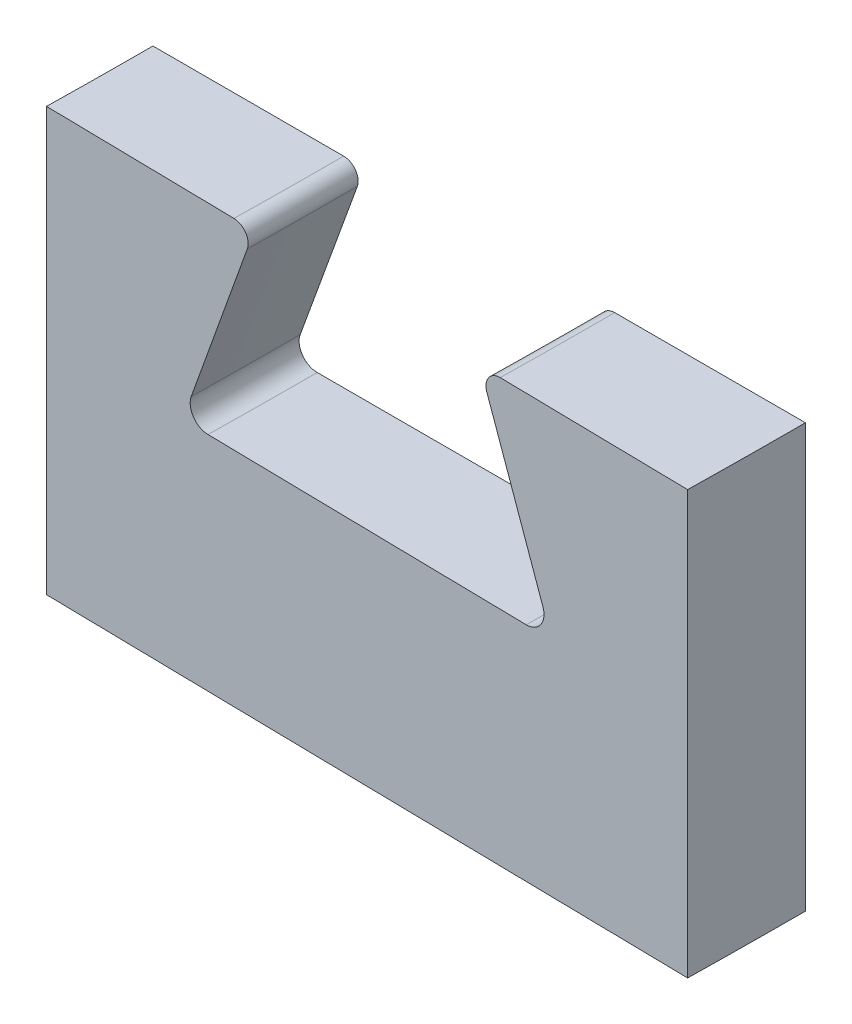
ISO-10303-21;
HEADER;
FILE_DESCRIPTION(('STEP AP214'),'2;1');
FILE_NAME('part.step','',(''),(''),'','','');
FILE_SCHEMA(('AUTOMOTIVE_DESIGN { 1 0 10303 214 1 1 1 1 }'));
ENDSEC;
DATA;
#1=APPLICATION_CONTEXT('core data for automotive mechanical design processes');
#2=APPLICATION_PROTOCOL_DEFINITION('international standard','automotive_design',2000,#1);
#3=PRODUCT_CONTEXT('',#1,'mechanical');
#4=PRODUCT('Part','Part','',(#3));
#5=PRODUCT_RELATED_PRODUCT_CATEGORY('part','',(#4));
#6=PRODUCT_DEFINITION_FORMATION('','',#4);
#7=PRODUCT_DEFINITION_CONTEXT('part definition',#1,'design');
#8=PRODUCT_DEFINITION('design','',#6,#7);
#9=PRODUCT_DEFINITION_SHAPE('','',#8);
#10=(LENGTH_UNIT() NAMED_UNIT(*) SI_UNIT(.MILLI.,.METRE.));
#11=(NAMED_UNIT(*) PLANE_ANGLE_UNIT() SI_UNIT($,.RADIAN.));
#12=(NAMED_UNIT(*) SI_UNIT($,.STERADIAN.) SOLID_ANGLE_UNIT());
#13=UNCERTAINTY_MEASURE_WITH_UNIT(LENGTH_MEASURE(1.E-05),#10,'distance_accuracy_value','');
#14=(GEOMETRIC_REPRESENTATION_CONTEXT(3) GLOBAL_UNCERTAINTY_ASSIGNED_CONTEXT((#13)) GLOBAL_UNIT_ASSIGNED_CONTEXT((#10,
#11,#12)) REPRESENTATION_CONTEXT('',''));
#15=CARTESIAN_POINT('',(0.,0.,0.));
#16=DIRECTION('',(0.,0.,1.));
#17=DIRECTION('',(1.,0.,0.));
#18=AXIS2_PLACEMENT_3D('',#15,#16,#17);
#19=CARTESIAN_POINT('',(-133.858,5.0546,0.));
#20=DIRECTION('',(0.,1.,0.));
#21=DIRECTION('',(0.,0.,1.));
#22=AXIS2_PLACEMENT_3D('',#19,#20,#21);
#23=TOROIDAL_SURFACE('',#22,130.454103897582,0.381000000000001);
#24=CARTESIAN_POINT('',(-133.858,5.18494180003675,0.));
#25=DIRECTION('',(0.,1.,0.));
#26=DIRECTION('',(0.,0.,1.));
#27=AXIS2_PLACEMENT_3D('',#24,#25,#26);
#28=CIRCLE('',#27,130.096092703395);
#29=CARTESIAN_POINT('',(-3.78172156165854,5.18494180003675,2.27048988576216));
#30=VERTEX_POINT('',#29);
#31=CARTESIAN_POINT('',(-3.76190729660525,5.18494180003675,0.));
#32=VERTEX_POINT('',#31);
#33=EDGE_CURVE('E11',#30,#32,#28,.T.);
#34=ORIENTED_EDGE('',*,*,#33,.F.);
#35=CARTESIAN_POINT('',(-3.42376489431051,5.0546,2.27673804263221));
#36=DIRECTION('',(0.0174524064372835,0.,-0.999847695156391));
#37=DIRECTION('',(0.999847695156391,0.,0.0174524064372835));
#38=AXIS2_PLACEMENT_3D('',#35,#36,#37);
#39=CIRCLE('',#38,0.381000000000001);
#40=CARTESIAN_POINT('',(-3.42376489431051,4.6736,2.27673804263221));
#41=VERTEX_POINT('',#40);
#42=EDGE_CURVE('E176',#41,#30,#39,.T.);
#43=ORIENTED_EDGE('',*,*,#42,.F.);
#44=CARTESIAN_POINT('',(-133.858,4.6736,0.));
#45=DIRECTION('',(0.,1.,0.));
#46=DIRECTION('',(0.,0.,1.));
#47=AXIS2_PLACEMENT_3D('',#44,#45,#46);
#48=CIRCLE('',#47,130.454103897582);
#49=CARTESIAN_POINT('',(-3.40389610241828,4.6736,0.));
#50=VERTEX_POINT('',#49);
#51=EDGE_CURVE('E56',#41,#50,#48,.T.);
#52=ORIENTED_EDGE('',*,*,#51,.T.);
#53=CARTESIAN_POINT('',(-3.40389610241828,5.0546,0.));
#54=DIRECTION('',(0.,0.,-1.));
#55=DIRECTION('',(1.,0.,0.));
#56=AXIS2_PLACEMENT_3D('',#53,#54,#55);
#57=CIRCLE('',#56,0.381000000000001);
#58=EDGE_CURVE('E140',#50,#32,#57,.T.);
#59=ORIENTED_EDGE('',*,*,#58,.T.);
#60=EDGE_LOOP('',(#34,#43,#52,#59));
#61=FACE_BOUND('',#60,.T.);
#62=ADVANCED_FACE('F41',(#61),#23,.F.);
#63=CARTESIAN_POINT('',(-133.858,5.18494180003675,0.));
#64=DIRECTION('',(0.,1.,0.));
#65=DIRECTION('',(0.,0.,1.));
#66=AXIS2_PLACEMENT_3D('',#63,#64,#65);
#67=CONICAL_SURFACE('',#66,130.096092703395,0.349155581964493);
#68=CARTESIAN_POINT('',(-133.858,8.4809265112345,0.));
#69=DIRECTION('',(0.,1.,0.));
#70=DIRECTION('',(0.,0.,1.));
#71=AXIS2_PLACEMENT_3D('',#68,#69,#70);
#72=CIRCLE('',#71,131.296067975472);
#73=CARTESIAN_POINT('',(-2.58192905162774,8.4809265112345,2.29143234192514));
#74=VERTEX_POINT('',#73);
#75=CARTESIAN_POINT('',(-2.56193202452829,8.4809265112345,0.));
#76=VERTEX_POINT('',#75);
#77=EDGE_CURVE('E49',#74,#76,#72,.T.);
#78=ORIENTED_EDGE('',*,*,#77,.F.);
#79=DIRECTION('',(0.342052357872111,0.939661926999925,0.00597054611550764));
#80=VECTOR('',#79,1.);
#81=CARTESIAN_POINT('',(-2.58192905162774,8.4809265112345,2.29143234192514));
#82=LINE('',#81,#80);
#83=EDGE_CURVE('E136',#30,#74,#82,.T.);
#84=ORIENTED_EDGE('',*,*,#83,.F.);
#85=ORIENTED_EDGE('',*,*,#33,.T.);
#86=DIRECTION('',(0.3421044620387,0.939661926999925,0.));
#87=VECTOR('',#86,1.);
#88=CARTESIAN_POINT('',(-2.56193202452829,8.4809265112345,0.));
#89=LINE('',#88,#87);
#90=EDGE_CURVE('E133',#32,#76,#89,.T.);
#91=ORIENTED_EDGE('',*,*,#90,.T.);
#92=EDGE_LOOP('',(#78,#84,#85,#91));
#93=FACE_BOUND('',#92,.T.);
#94=ADVANCED_FACE('F43',(#93),#67,.T.);
#95=CARTESIAN_POINT('',(-133.858,8.5851999636868,0.));
#96=DIRECTION('',(0.,1.,0.));
#97=DIRECTION('',(0.,0.,1.));
#98=AXIS2_PLACEMENT_3D('',#95,#96,#97);
#99=TOROIDAL_SURFACE('',#98,131.009658986,0.304800036313197);
#100=CARTESIAN_POINT('',(-133.858,8.89,0.));
#101=DIRECTION('',(0.,1.,0.));
#102=DIRECTION('',(0.,0.,1.));
#103=AXIS2_PLACEMENT_3D('',#100,#101,#102);
#104=CIRCLE('',#103,131.009658986);
#105=CARTESIAN_POINT('',(-2.86829441962309,8.89,2.28643381583359));
#106=VERTEX_POINT('',#105);
#107=CARTESIAN_POINT('',(-2.848341014,8.89,0.));
#108=VERTEX_POINT('',#107);
#109=EDGE_CURVE('E224',#106,#108,#104,.T.);
#110=ORIENTED_EDGE('',*,*,#109,.F.);
#111=CARTESIAN_POINT('',(-2.86829441962309,8.5851999636868,2.28643381583359));
#112=DIRECTION('',(-0.0174524064372835,0.,0.999847695156391));
#113=DIRECTION('',(-0.999847695156391,0.,-0.0174524064372835));
#114=AXIS2_PLACEMENT_3D('',#111,#112,#113);
#115=CIRCLE('',#114,0.304800036313197);
#116=EDGE_CURVE('E179',#74,#106,#115,.T.);
#117=ORIENTED_EDGE('',*,*,#116,.F.);
#118=ORIENTED_EDGE('',*,*,#77,.T.);
#119=CARTESIAN_POINT('',(-2.848341014,8.5851999636868,0.));
#120=DIRECTION('',(0.,0.,1.));
#121=DIRECTION('',(-1.,0.,0.));
#122=AXIS2_PLACEMENT_3D('',#119,#120,#121);
#123=CIRCLE('',#122,0.304800036313197);
#124=EDGE_CURVE('E147',#76,#108,#123,.T.);
#125=ORIENTED_EDGE('',*,*,#124,.T.);
#126=EDGE_LOOP('',(#110,#117,#118,#125));
#127=FACE_BOUND('',#126,.T.);
#128=ADVANCED_FACE('F227',(#127),#99,.T.);
#129=CARTESIAN_POINT('',(-6.87734271513831,8.89,2.21645561753501));
#130=DIRECTION('',(0.,-1.,0.));
#131=DIRECTION('',(0.,0.,-1.));
#132=AXIS2_PLACEMENT_3D('',#129,#130,#131);
#133=PLANE('',#132);
#134=CARTESIAN_POINT('',(-133.858,8.89,0.));
#135=DIRECTION('',(0.,1.,0.));
#136=DIRECTION('',(0.,0.,1.));
#137=AXIS2_PLACEMENT_3D('',#134,#135,#136);
#138=CIRCLE('',#137,127.);
#139=CARTESIAN_POINT('',(-6.87734271513831,8.89,2.21645561753501));
#140=VERTEX_POINT('',#139);
#141=CARTESIAN_POINT('',(-6.858,8.89,0.));
#142=VERTEX_POINT('',#141);
#143=EDGE_CURVE('E222',#140,#142,#138,.T.);
#144=ORIENTED_EDGE('',*,*,#143,.F.);
#145=DIRECTION('',(-0.999847695156391,0.,-0.0174524064372835));
#146=VECTOR('',#145,1.);
#147=CARTESIAN_POINT('',(-6.87734271513831,8.89,2.21645561753501));
#148=LINE('',#147,#146);
#149=EDGE_CURVE('E182',#106,#140,#148,.T.);
#150=ORIENTED_EDGE('',*,*,#149,.F.);
#151=ORIENTED_EDGE('',*,*,#109,.T.);
#152=DIRECTION('',(-1.,0.,0.));
#153=VECTOR('',#152,1.);
#154=CARTESIAN_POINT('',(-6.858,8.89,0.));
#155=LINE('',#154,#153);
#156=EDGE_CURVE('E149',#108,#142,#155,.T.);
#157=ORIENTED_EDGE('',*,*,#156,.T.);
#158=EDGE_LOOP('',(#144,#150,#151,#157));
#159=FACE_BOUND('',#158,.T.);
#160=ADVANCED_FACE('F259',(#159),#133,.F.);
#161=CARTESIAN_POINT('',(-133.858,15.8510320827148,0.));
#162=DIRECTION('',(0.,1.,0.));
#163=DIRECTION('',(0.,0.,1.));
#164=AXIS2_PLACEMENT_3D('',#161,#162,#163);
#165=CYLINDRICAL_SURFACE('',#164,127.);
#166=CARTESIAN_POINT('',(-133.858,0.,0.));
#167=DIRECTION('',(0.,1.,0.));
#168=DIRECTION('',(0.,0.,1.));
#169=AXIS2_PLACEMENT_3D('',#166,#167,#168);
#170=CIRCLE('',#169,127.);
#171=CARTESIAN_POINT('',(-6.8773427151383,0.,2.21645561753501));
#172=VERTEX_POINT('',#171);
#173=CARTESIAN_POINT('',(-6.858,0.,0.));
#174=VERTEX_POINT('',#173);
#175=EDGE_CURVE('E220',#172,#174,#170,.T.);
#176=ORIENTED_EDGE('',*,*,#175,.F.);
#177=DIRECTION('',(0.,-1.,0.));
#178=VECTOR('',#177,1.);
#179=CARTESIAN_POINT('',(-6.8773427151383,0.,2.21645561753501));
#180=LINE('',#179,#178);
#181=EDGE_CURVE('E185',#140,#172,#180,.T.);
#182=ORIENTED_EDGE('',*,*,#181,.F.);
#183=ORIENTED_EDGE('',*,*,#143,.T.);
#184=DIRECTION('',(0.,-1.,0.));
#185=VECTOR('',#184,1.);
#186=CARTESIAN_POINT('',(-6.858,0.,0.));
#187=LINE('',#186,#185);
#188=EDGE_CURVE('E154',#142,#174,#187,.T.);
#189=ORIENTED_EDGE('',*,*,#188,.T.);
#190=EDGE_LOOP('',(#176,#182,#183,#189));
#191=FACE_BOUND('',#190,.T.);
#192=ADVANCED_FACE('F257',(#191),#165,.F.);
#193=CARTESIAN_POINT('',(-6.8773427151383,0.,2.21645561753501));
#194=DIRECTION('',(0.,1.,0.));
#195=DIRECTION('',(0.,0.,1.));
#196=AXIS2_PLACEMENT_3D('',#193,#194,#195);
#197=PLANE('',#196);
#198=CARTESIAN_POINT('',(-133.858,0.,0.));
#199=DIRECTION('',(0.,1.,0.));
#200=DIRECTION('',(0.,0.,1.));
#201=AXIS2_PLACEMENT_3D('',#198,#199,#200);
#202=CIRCLE('',#201,140.716);
#203=CARTESIAN_POINT('',(6.83656827162675,0.,2.45583282422879));
#204=VERTEX_POINT('',#203);
#205=CARTESIAN_POINT('',(6.858,0.,0.));
#206=VERTEX_POINT('',#205);
#207=EDGE_CURVE('E218',#204,#206,#202,.T.);
#208=ORIENTED_EDGE('',*,*,#207,.F.);
#209=DIRECTION('',(0.999847695156391,0.,0.0174524064372835));
#210=VECTOR('',#209,1.);
#211=CARTESIAN_POINT('',(-6.8773427151383,0.,2.21645561753501));
#212=LINE('',#211,#210);
#213=EDGE_CURVE('E188',#172,#204,#212,.T.);
#214=ORIENTED_EDGE('',*,*,#213,.F.);
#215=ORIENTED_EDGE('',*,*,#175,.T.);
#216=DIRECTION('',(1.,0.,0.));
#217=VECTOR('',#216,1.);
#218=CARTESIAN_POINT('',(-6.858,0.,0.));
#219=LINE('',#218,#217);
#220=EDGE_CURVE('E157',#174,#206,#219,.T.);
#221=ORIENTED_EDGE('',*,*,#220,.T.);
#222=EDGE_LOOP('',(#208,#214,#215,#221));
#223=FACE_BOUND('',#222,.T.);
#224=ADVANCED_FACE('F254',(#223),#197,.F.);
#225=CARTESIAN_POINT('',(-133.858,15.8510320827148,0.));
#226=DIRECTION('',(0.,1.,0.));
#227=DIRECTION('',(0.,0.,1.));
#228=AXIS2_PLACEMENT_3D('',#225,#226,#227);
#229=CYLINDRICAL_SURFACE('',#228,140.716);
#230=CARTESIAN_POINT('',(-133.858,8.89,0.));
#231=DIRECTION('',(0.,1.,0.));
#232=DIRECTION('',(0.,0.,1.));
#233=AXIS2_PLACEMENT_3D('',#230,#231,#232);
#234=CIRCLE('',#233,140.716);
#235=CARTESIAN_POINT('',(6.83656827162675,8.89,2.45583282422879));
#236=VERTEX_POINT('',#235);
#237=CARTESIAN_POINT('',(6.858,8.89,0.));
#238=VERTEX_POINT('',#237);
#239=EDGE_CURVE('E216',#236,#238,#234,.T.);
#240=ORIENTED_EDGE('',*,*,#239,.F.);
#241=DIRECTION('',(0.,1.,0.));
#242=VECTOR('',#241,1.);
#243=CARTESIAN_POINT('',(6.83656827162675,0.,2.45583282422879));
#244=LINE('',#243,#242);
#245=EDGE_CURVE('E191',#204,#236,#244,.T.);
#246=ORIENTED_EDGE('',*,*,#245,.F.);
#247=ORIENTED_EDGE('',*,*,#207,.T.);
#248=DIRECTION('',(0.,1.,0.));
#249=VECTOR('',#248,1.);
#250=CARTESIAN_POINT('',(6.858,0.,0.));
#251=LINE('',#250,#249);
#252=EDGE_CURVE('E160',#206,#238,#251,.T.);
#253=ORIENTED_EDGE('',*,*,#252,.T.);
#254=EDGE_LOOP('',(#240,#246,#247,#253));
#255=FACE_BOUND('',#254,.T.);
#256=ADVANCED_FACE('F250',(#255),#229,.T.);
#257=CARTESIAN_POINT('',(6.83656827162675,8.89,2.45583282422879));
#258=DIRECTION('',(0.,-1.,0.));
#259=DIRECTION('',(0.,0.,-1.));
#260=AXIS2_PLACEMENT_3D('',#257,#258,#259);
#261=PLANE('',#260);
#262=CARTESIAN_POINT('',(-133.858,8.89,0.));
#263=DIRECTION('',(0.,1.,0.));
#264=DIRECTION('',(0.,0.,1.));
#265=AXIS2_PLACEMENT_3D('',#262,#263,#264);
#266=CIRCLE('',#265,136.706341014);
#267=CARTESIAN_POINT('',(2.82751997611154,8.89,2.38585462593021));
#268=VERTEX_POINT('',#267);
#269=CARTESIAN_POINT('',(2.848341014,8.89,0.));
#270=VERTEX_POINT('',#269);
#271=EDGE_CURVE('E214',#268,#270,#266,.T.);
#272=ORIENTED_EDGE('',*,*,#271,.F.);
#273=DIRECTION('',(-0.999847695156391,0.,-0.0174524064372835));
#274=VECTOR('',#273,1.);
#275=CARTESIAN_POINT('',(6.83656827162675,8.89,2.45583282422879));
#276=LINE('',#275,#274);
#277=EDGE_CURVE('E194',#236,#268,#276,.T.);
#278=ORIENTED_EDGE('',*,*,#277,.F.);
#279=ORIENTED_EDGE('',*,*,#239,.T.);
#280=DIRECTION('',(-1.,0.,0.));
#281=VECTOR('',#280,1.);
#282=CARTESIAN_POINT('',(6.858,8.89,0.));
#283=LINE('',#282,#281);
#284=EDGE_CURVE('E163',#238,#270,#283,.T.);
#285=ORIENTED_EDGE('',*,*,#284,.T.);
#286=EDGE_LOOP('',(#272,#278,#279,#285));
#287=FACE_BOUND('',#286,.T.);
#288=ADVANCED_FACE('F245',(#287),#261,.F.);
#289=CARTESIAN_POINT('',(-133.858,8.5851999636868,0.));
#290=DIRECTION('',(0.,1.,0.));
#291=DIRECTION('',(0.,0.,1.));
#292=AXIS2_PLACEMENT_3D('',#289,#290,#291);
#293=TOROIDAL_SURFACE('',#292,136.706341014,0.304800036313197);
#294=CARTESIAN_POINT('',(-133.858,8.4809265112345,0.));
#295=DIRECTION('',(0.,1.,0.));
#296=DIRECTION('',(0.,0.,1.));
#297=AXIS2_PLACEMENT_3D('',#294,#295,#296);
#298=CIRCLE('',#297,136.419932024528);
#299=CARTESIAN_POINT('',(2.54115460811619,8.4809265112345,2.38085609983866));
#300=VERTEX_POINT('',#299);
#301=CARTESIAN_POINT('',(2.5619320245283,8.4809265112345,0.));
#302=VERTEX_POINT('',#301);
#303=EDGE_CURVE('E212',#300,#302,#298,.T.);
#304=ORIENTED_EDGE('',*,*,#303,.F.);
#305=CARTESIAN_POINT('',(2.82751997611154,8.5851999636868,2.38585462593021));
#306=DIRECTION('',(-0.0174524064372835,0.,0.999847695156391));
#307=DIRECTION('',(0.999847695156391,0.,0.0174524064372835));
#308=AXIS2_PLACEMENT_3D('',#305,#306,#307);
#309=CIRCLE('',#308,0.304800036313197);
#310=EDGE_CURVE('E197',#268,#300,#309,.T.);
#311=ORIENTED_EDGE('',*,*,#310,.F.);
#312=ORIENTED_EDGE('',*,*,#271,.T.);
#313=CARTESIAN_POINT('',(2.848341014,8.5851999636868,0.));
#314=DIRECTION('',(0.,0.,1.));
#315=DIRECTION('',(1.,0.,0.));
#316=AXIS2_PLACEMENT_3D('',#313,#314,#315);
#317=CIRCLE('',#316,0.304800036313197);
#318=EDGE_CURVE('E166',#270,#302,#317,.T.);
#319=ORIENTED_EDGE('',*,*,#318,.T.);
#320=EDGE_LOOP('',(#304,#311,#312,#319));
#321=FACE_BOUND('',#320,.T.);
#322=ADVANCED_FACE('F242',(#321),#293,.T.);
#323=CARTESIAN_POINT('',(-133.858,8.4809265112345,0.));
#324=DIRECTION('',(0.,-1.,0.));
#325=DIRECTION('',(0.,0.,-1.));
#326=AXIS2_PLACEMENT_3D('',#323,#324,#325);
#327=CONICAL_SURFACE('',#326,136.419932024528,0.349155581964493);
#328=CARTESIAN_POINT('',(-133.858,5.18494180003675,0.));
#329=DIRECTION('',(0.,1.,0.));
#330=DIRECTION('',(0.,0.,1.));
#331=AXIS2_PLACEMENT_3D('',#328,#329,#330);
#332=CIRCLE('',#331,137.619907296605);
#333=CARTESIAN_POINT('',(3.74094711814699,5.18494180003675,2.40179855600164));
#334=VERTEX_POINT('',#333);
#335=CARTESIAN_POINT('',(3.76190729660525,5.18494180003675,0.));
#336=VERTEX_POINT('',#335);
#337=EDGE_CURVE('E210',#334,#336,#332,.T.);
#338=ORIENTED_EDGE('',*,*,#337,.F.);
#339=DIRECTION('',(0.342052357872112,-0.939661926999924,0.00597054611550764));
#340=VECTOR('',#339,1.);
#341=CARTESIAN_POINT('',(2.54115460811619,8.4809265112345,2.38085609983866));
#342=LINE('',#341,#340);
#343=EDGE_CURVE('E200',#300,#334,#342,.T.);
#344=ORIENTED_EDGE('',*,*,#343,.F.);
#345=ORIENTED_EDGE('',*,*,#303,.T.);
#346=DIRECTION('',(0.3421044620387,-0.939661926999924,0.));
#347=VECTOR('',#346,1.);
#348=CARTESIAN_POINT('',(2.5619320245283,8.4809265112345,0.));
#349=LINE('',#348,#347);
#350=EDGE_CURVE('E169',#302,#336,#349,.T.);
#351=ORIENTED_EDGE('',*,*,#350,.T.);
#352=EDGE_LOOP('',(#338,#344,#345,#351));
#353=FACE_BOUND('',#352,.T.);
#354=ADVANCED_FACE('F238',(#353),#327,.F.);
#355=CARTESIAN_POINT('',(-133.858,5.0546,0.));
#356=DIRECTION('',(0.,1.,0.));
#357=DIRECTION('',(0.,0.,1.));
#358=AXIS2_PLACEMENT_3D('',#355,#356,#357);
#359=TOROIDAL_SURFACE('',#358,137.261896102418,0.381000000000001);
#360=CARTESIAN_POINT('',(-133.858,4.6736,0.));
#361=DIRECTION('',(0.,1.,0.));
#362=DIRECTION('',(0.,0.,1.));
#363=AXIS2_PLACEMENT_3D('',#360,#361,#362);
#364=CIRCLE('',#363,137.261896102418);
#365=CARTESIAN_POINT('',(3.38299045079896,4.6736,2.39555039913159));
#366=VERTEX_POINT('',#365);
#367=CARTESIAN_POINT('',(3.40389610241828,4.6736,0.));
#368=VERTEX_POINT('',#367);
#369=EDGE_CURVE('E64',#366,#368,#364,.T.);
#370=ORIENTED_EDGE('',*,*,#369,.F.);
#371=CARTESIAN_POINT('',(3.38299045079896,5.0546,2.39555039913159));
#372=DIRECTION('',(0.0174524064372835,0.,-0.999847695156391));
#373=DIRECTION('',(-0.999847695156391,0.,-0.0174524064372835));
#374=AXIS2_PLACEMENT_3D('',#371,#372,#373);
#375=CIRCLE('',#374,0.381000000000001);
#376=EDGE_CURVE('E203',#334,#366,#375,.T.);
#377=ORIENTED_EDGE('',*,*,#376,.F.);
#378=ORIENTED_EDGE('',*,*,#337,.T.);
#379=CARTESIAN_POINT('',(3.40389610241828,5.0546,0.));
#380=DIRECTION('',(0.,0.,-1.));
#381=DIRECTION('',(-1.,0.,0.));
#382=AXIS2_PLACEMENT_3D('',#379,#380,#381);
#383=CIRCLE('',#382,0.381000000000001);
#384=EDGE_CURVE('E172',#336,#368,#383,.T.);
#385=ORIENTED_EDGE('',*,*,#384,.T.);
#386=EDGE_LOOP('',(#370,#377,#378,#385));
#387=FACE_BOUND('',#386,.T.);
#388=ADVANCED_FACE('F233',(#387),#359,.F.);
#389=CARTESIAN_POINT('',(-3.42376489431051,4.6736,2.27673804263221));
#390=DIRECTION('',(0.,-1.,0.));
#391=DIRECTION('',(0.,0.,-1.));
#392=AXIS2_PLACEMENT_3D('',#389,#390,#391);
#393=PLANE('',#392);
#394=DIRECTION('',(-0.999847695156391,0.,-0.0174524064372835));
#395=VECTOR('',#394,1.);
#396=CARTESIAN_POINT('',(-3.42376489431051,4.6736,2.27673804263221));
#397=LINE('',#396,#395);
#398=EDGE_CURVE('E205',#366,#41,#397,.T.);
#399=ORIENTED_EDGE('',*,*,#398,.F.);
#400=ORIENTED_EDGE('',*,*,#369,.T.);
#401=DIRECTION('',(-1.,0.,0.));
#402=VECTOR('',#401,1.);
#403=CARTESIAN_POINT('',(-3.40389610241828,4.6736,0.));
#404=LINE('',#403,#402);
#405=EDGE_CURVE('E174',#368,#50,#404,.T.);
#406=ORIENTED_EDGE('',*,*,#405,.T.);
#407=ORIENTED_EDGE('',*,*,#51,.F.);
#408=EDGE_LOOP('',(#399,#400,#406,#407));
#409=FACE_BOUND('',#408,.T.);
#410=ADVANCED_FACE('F231',(#409),#393,.F.);
#411=CARTESIAN_POINT('',(-3.42376489431051,5.0546,2.27673804263221));
#412=DIRECTION('',(-0.0174524064372835,0.,0.999847695156391));
#413=DIRECTION('',(0.999847695156391,0.,0.0174524064372835));
#414=AXIS2_PLACEMENT_3D('',#411,#412,#413);
#415=PLANE('',#414);
#416=ORIENTED_EDGE('',*,*,#42,.T.);
#417=ORIENTED_EDGE('',*,*,#83,.T.);
#418=ORIENTED_EDGE('',*,*,#116,.T.);
#419=ORIENTED_EDGE('',*,*,#149,.T.);
#420=ORIENTED_EDGE('',*,*,#181,.T.);
#421=ORIENTED_EDGE('',*,*,#213,.T.);
#422=ORIENTED_EDGE('',*,*,#245,.T.);
#423=ORIENTED_EDGE('',*,*,#277,.T.);
#424=ORIENTED_EDGE('',*,*,#310,.T.);
#425=ORIENTED_EDGE('',*,*,#343,.T.);
#426=ORIENTED_EDGE('',*,*,#376,.T.);
#427=ORIENTED_EDGE('',*,*,#398,.T.);
#428=EDGE_LOOP('',(#416,#417,#418,#419,#420,#421,#422,#423,#424,#425,#426,#427));
#429=FACE_BOUND('',#428,.T.);
#430=ADVANCED_FACE('F229',(#429),#415,.T.);
#431=CARTESIAN_POINT('',(-3.40389610241828,5.0546,0.));
#432=DIRECTION('',(0.,0.,1.));
#433=DIRECTION('',(1.,0.,0.));
#434=AXIS2_PLACEMENT_3D('',#431,#432,#433);
#435=PLANE('',#434);
#436=ORIENTED_EDGE('',*,*,#58,.F.);
#437=ORIENTED_EDGE('',*,*,#405,.F.);
#438=ORIENTED_EDGE('',*,*,#384,.F.);
#439=ORIENTED_EDGE('',*,*,#350,.F.);
#440=ORIENTED_EDGE('',*,*,#318,.F.);
#441=ORIENTED_EDGE('',*,*,#284,.F.);
#442=ORIENTED_EDGE('',*,*,#252,.F.);
#443=ORIENTED_EDGE('',*,*,#220,.F.);
#444=ORIENTED_EDGE('',*,*,#188,.F.);
#445=ORIENTED_EDGE('',*,*,#156,.F.);
#446=ORIENTED_EDGE('',*,*,#124,.F.);
#447=ORIENTED_EDGE('',*,*,#90,.F.);
#448=EDGE_LOOP('',(#436,#437,#438,#439,#440,#441,#442,#443,#444,#445,#446,#447));
#449=FACE_BOUND('',#448,.T.);
#450=ADVANCED_FACE('F144',(#449),#435,.F.);
#451=CLOSED_SHELL('',(#62,#94,#128,#160,#192,#224,#256,#288,#322,#354,#388,#410,#430,#450));
#452=MANIFOLD_SOLID_BREP('B2',#451);
#453=ADVANCED_BREP_SHAPE_REPRESENTATION('',(#18,#452),#14);
#454=SHAPE_DEFINITION_REPRESENTATION(#9,#453);
ENDSEC;
END-ISO-10303-21;
